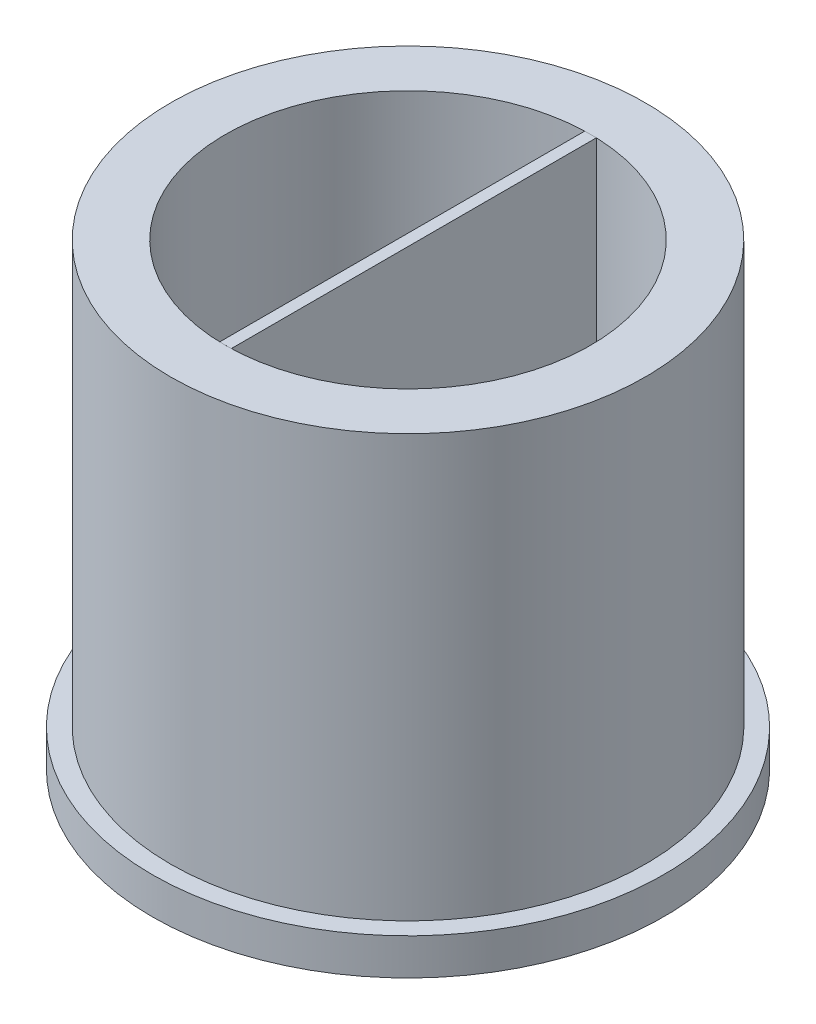
ISO-10303-21;
HEADER;
FILE_DESCRIPTION(('STEP AP214'),'2;1');
FILE_NAME('part.step','',(''),(''),'','','');
FILE_SCHEMA(('AUTOMOTIVE_DESIGN { 1 0 10303 214 1 1 1 1 }'));
ENDSEC;
DATA;
#1=APPLICATION_CONTEXT('core data for automotive mechanical design processes');
#2=APPLICATION_PROTOCOL_DEFINITION('international standard','automotive_design',2000,#1);
#3=PRODUCT_CONTEXT('',#1,'mechanical');
#4=PRODUCT('Part','Part','',(#3));
#5=PRODUCT_RELATED_PRODUCT_CATEGORY('part','',(#4));
#6=PRODUCT_DEFINITION_FORMATION('','',#4);
#7=PRODUCT_DEFINITION_CONTEXT('part definition',#1,'design');
#8=PRODUCT_DEFINITION('design','',#6,#7);
#9=PRODUCT_DEFINITION_SHAPE('','',#8);
#10=(LENGTH_UNIT() NAMED_UNIT(*) SI_UNIT(.MILLI.,.METRE.));
#11=(NAMED_UNIT(*) PLANE_ANGLE_UNIT() SI_UNIT($,.RADIAN.));
#12=(NAMED_UNIT(*) SI_UNIT($,.STERADIAN.) SOLID_ANGLE_UNIT());
#13=UNCERTAINTY_MEASURE_WITH_UNIT(LENGTH_MEASURE(1.E-05),#10,'distance_accuracy_value','');
#14=(GEOMETRIC_REPRESENTATION_CONTEXT(3) GLOBAL_UNCERTAINTY_ASSIGNED_CONTEXT((#13)) GLOBAL_UNIT_ASSIGNED_CONTEXT((#10,
#11,#12)) REPRESENTATION_CONTEXT('',''));
#15=CARTESIAN_POINT('',(0.,0.,0.));
#16=DIRECTION('',(0.,0.,1.));
#17=DIRECTION('',(1.,0.,0.));
#18=AXIS2_PLACEMENT_3D('',#15,#16,#17);
#19=CARTESIAN_POINT('',(0.,-10.,0.));
#20=DIRECTION('',(0.,1.,0.));
#21=DIRECTION('',(0.,0.,1.));
#22=AXIS2_PLACEMENT_3D('',#19,#20,#21);
#23=CYLINDRICAL_SURFACE('',#22,140.);
#24=CARTESIAN_POINT('',(0.,-10.,0.));
#25=DIRECTION('',(0.,1.,0.));
#26=DIRECTION('',(0.,0.,1.));
#27=AXIS2_PLACEMENT_3D('',#24,#25,#26);
#28=CIRCLE('',#27,140.);
#29=CARTESIAN_POINT('',(0.,-10.,140.));
#30=VERTEX_POINT('',#29);
#31=EDGE_CURVE('E11',#30,#30,#28,.T.);
#32=ORIENTED_EDGE('',*,*,#31,.T.);
#33=EDGE_LOOP('',(#32));
#34=FACE_BOUND('',#33,.T.);
#35=CARTESIAN_POINT('',(0.,10.,0.));
#36=DIRECTION('',(0.,1.,0.));
#37=DIRECTION('',(0.,0.,1.));
#38=AXIS2_PLACEMENT_3D('',#35,#36,#37);
#39=CIRCLE('',#38,140.);
#40=CARTESIAN_POINT('',(0.,10.,140.));
#41=VERTEX_POINT('',#40);
#42=EDGE_CURVE('E62',#41,#41,#39,.T.);
#43=ORIENTED_EDGE('',*,*,#42,.F.);
#44=EDGE_LOOP('',(#43));
#45=FACE_BOUND('',#44,.T.);
#46=ADVANCED_FACE('F56',(#34,#45),#23,.T.);
#47=CARTESIAN_POINT('',(0.,-10.,0.));
#48=DIRECTION('',(0.,1.,0.));
#49=DIRECTION('',(0.,0.,1.));
#50=AXIS2_PLACEMENT_3D('',#47,#48,#49);
#51=PLANE('',#50);
#52=ORIENTED_EDGE('',*,*,#31,.F.);
#53=EDGE_LOOP('',(#52));
#54=FACE_BOUND('',#53,.T.);
#55=ADVANCED_FACE('F86',(#54),#51,.F.);
#56=CARTESIAN_POINT('',(0.,10.,0.));
#57=DIRECTION('',(0.,1.,0.));
#58=DIRECTION('',(0.,0.,1.));
#59=AXIS2_PLACEMENT_3D('',#56,#57,#58);
#60=PLANE('',#59);
#61=ORIENTED_EDGE('',*,*,#42,.T.);
#62=EDGE_LOOP('',(#61));
#63=FACE_BOUND('',#62,.T.);
#64=CARTESIAN_POINT('',(0.,10.,0.));
#65=DIRECTION('',(0.,1.,0.));
#66=DIRECTION('',(0.,0.,1.));
#67=AXIS2_PLACEMENT_3D('',#64,#65,#66);
#68=CIRCLE('',#67,130.);
#69=CARTESIAN_POINT('',(0.,10.,130.));
#70=VERTEX_POINT('',#69);
#71=EDGE_CURVE('E66',#70,#70,#68,.T.);
#72=ORIENTED_EDGE('',*,*,#71,.F.);
#73=EDGE_LOOP('',(#72));
#74=FACE_BOUND('',#73,.T.);
#75=ADVANCED_FACE('F80',(#63,#74),#60,.T.);
#76=CARTESIAN_POINT('',(0.,10.,0.));
#77=DIRECTION('',(0.,-1.,0.));
#78=DIRECTION('',(0.,0.,-1.));
#79=AXIS2_PLACEMENT_3D('',#76,#77,#78);
#80=CYLINDRICAL_SURFACE('',#79,130.);
#81=ORIENTED_EDGE('',*,*,#71,.T.);
#82=EDGE_LOOP('',(#81));
#83=FACE_BOUND('',#82,.T.);
#84=CARTESIAN_POINT('',(0.,0.,0.));
#85=DIRECTION('',(0.,1.,0.));
#86=DIRECTION('',(0.,0.,1.));
#87=AXIS2_PLACEMENT_3D('',#84,#85,#86);
#88=CIRCLE('',#87,130.);
#89=CARTESIAN_POINT('',(0.,0.,130.));
#90=VERTEX_POINT('',#89);
#91=EDGE_CURVE('E70',#90,#90,#88,.T.);
#92=ORIENTED_EDGE('',*,*,#91,.F.);
#93=EDGE_LOOP('',(#92));
#94=FACE_BOUND('',#93,.T.);
#95=ADVANCED_FACE('F78',(#83,#94),#80,.F.);
#96=CARTESIAN_POINT('',(0.,0.,0.));
#97=DIRECTION('',(0.,1.,0.));
#98=DIRECTION('',(0.,0.,1.));
#99=AXIS2_PLACEMENT_3D('',#96,#97,#98);
#100=PLANE('',#99);
#101=ORIENTED_EDGE('',*,*,#91,.T.);
#102=EDGE_LOOP('',(#101));
#103=FACE_BOUND('',#102,.T.);
#104=ADVANCED_FACE('F76',(#103),#100,.T.);
#105=CLOSED_SHELL('',(#46,#55,#75,#95,#104));
#106=MANIFOLD_SOLID_BREP('B2',#105);
#107=CARTESIAN_POINT('',(-3.175,241.01,-99.9495841662185));
#108=DIRECTION('',(0.,0.,1.));
#109=DIRECTION('',(1.,0.,0.));
#110=AXIS2_PLACEMENT_3D('',#107,#108,#109);
#111=PLANE('',#110);
#112=DIRECTION('',(-1.,0.,0.));
#113=VECTOR('',#112,1.);
#114=CARTESIAN_POINT('',(-3.175,0.,-99.9495841662185));
#115=LINE('',#114,#113);
#116=CARTESIAN_POINT('',(3.175,0.,-99.9495841662185));
#117=VERTEX_POINT('',#116);
#118=CARTESIAN_POINT('',(-3.175,0.,-99.9495841662185));
#119=VERTEX_POINT('',#118);
#120=EDGE_CURVE('E204',#117,#119,#115,.T.);
#121=ORIENTED_EDGE('',*,*,#120,.T.);
#122=DIRECTION('',(0.,-1.,0.));
#123=VECTOR('',#122,1.);
#124=CARTESIAN_POINT('',(-3.175,241.01,-99.9495841662185));
#125=LINE('',#124,#123);
#126=CARTESIAN_POINT('',(-3.175,241.01,-99.9495841662185));
#127=VERTEX_POINT('',#126);
#128=EDGE_CURVE('E54',#127,#119,#125,.T.);
#129=ORIENTED_EDGE('',*,*,#128,.F.);
#130=DIRECTION('',(-1.,0.,0.));
#131=VECTOR('',#130,1.);
#132=CARTESIAN_POINT('',(-3.175,241.01,-99.9495841662185));
#133=LINE('',#132,#131);
#134=CARTESIAN_POINT('',(3.175,241.01,-99.9495841662185));
#135=VERTEX_POINT('',#134);
#136=EDGE_CURVE('E192',#135,#127,#133,.T.);
#137=ORIENTED_EDGE('',*,*,#136,.F.);
#138=DIRECTION('',(0.,-1.,0.));
#139=VECTOR('',#138,1.);
#140=CARTESIAN_POINT('',(3.175,241.01,-99.9495841662185));
#141=LINE('',#140,#139);
#142=EDGE_CURVE('E200',#135,#117,#141,.T.);
#143=ORIENTED_EDGE('',*,*,#142,.T.);
#144=EDGE_LOOP('',(#121,#129,#137,#143));
#145=FACE_BOUND('',#144,.T.);
#146=ADVANCED_FACE('F141',(#145),#111,.F.);
#147=CARTESIAN_POINT('',(-3.175,241.01,-99.9495841662185));
#148=DIRECTION('',(1.,0.,0.));
#149=DIRECTION('',(0.,0.,-1.));
#150=AXIS2_PLACEMENT_3D('',#147,#148,#149);
#151=PLANE('',#150);
#152=DIRECTION('',(0.,0.,1.));
#153=VECTOR('',#152,1.);
#154=CARTESIAN_POINT('',(-3.175,0.,-99.9495841662185));
#155=LINE('',#154,#153);
#156=CARTESIAN_POINT('',(-3.175,0.,99.9495841662185));
#157=VERTEX_POINT('',#156);
#158=EDGE_CURVE('E196',#119,#157,#155,.T.);
#159=ORIENTED_EDGE('',*,*,#158,.T.);
#160=DIRECTION('',(0.,-1.,0.));
#161=VECTOR('',#160,1.);
#162=CARTESIAN_POINT('',(-3.175,241.01,99.9495841662185));
#163=LINE('',#162,#161);
#164=CARTESIAN_POINT('',(-3.175,241.01,99.9495841662185));
#165=VERTEX_POINT('',#164);
#166=EDGE_CURVE('E149',#165,#157,#163,.T.);
#167=ORIENTED_EDGE('',*,*,#166,.F.);
#168=DIRECTION('',(0.,0.,1.));
#169=VECTOR('',#168,1.);
#170=CARTESIAN_POINT('',(-3.175,241.01,-99.9495841662185));
#171=LINE('',#170,#169);
#172=EDGE_CURVE('E187',#127,#165,#171,.T.);
#173=ORIENTED_EDGE('',*,*,#172,.F.);
#174=ORIENTED_EDGE('',*,*,#128,.T.);
#175=EDGE_LOOP('',(#159,#167,#173,#174));
#176=FACE_BOUND('',#175,.T.);
#177=ADVANCED_FACE('F195',(#176),#151,.F.);
#178=CARTESIAN_POINT('',(-3.175,241.01,99.9495841662185));
#179=DIRECTION('',(0.,0.,-1.));
#180=DIRECTION('',(-1.,0.,0.));
#181=AXIS2_PLACEMENT_3D('',#178,#179,#180);
#182=PLANE('',#181);
#183=DIRECTION('',(1.,0.,0.));
#184=VECTOR('',#183,1.);
#185=CARTESIAN_POINT('',(-3.175,0.,99.9495841662185));
#186=LINE('',#185,#184);
#187=CARTESIAN_POINT('',(3.175,0.,99.9495841662185));
#188=VERTEX_POINT('',#187);
#189=EDGE_CURVE('E174',#157,#188,#186,.T.);
#190=ORIENTED_EDGE('',*,*,#189,.T.);
#191=DIRECTION('',(0.,-1.,0.));
#192=VECTOR('',#191,1.);
#193=CARTESIAN_POINT('',(3.175,241.01,99.9495841662185));
#194=LINE('',#193,#192);
#195=CARTESIAN_POINT('',(3.175,241.01,99.9495841662185));
#196=VERTEX_POINT('',#195);
#197=EDGE_CURVE('E197',#196,#188,#194,.T.);
#198=ORIENTED_EDGE('',*,*,#197,.F.);
#199=DIRECTION('',(1.,0.,0.));
#200=VECTOR('',#199,1.);
#201=CARTESIAN_POINT('',(-3.175,241.01,99.9495841662185));
#202=LINE('',#201,#200);
#203=EDGE_CURVE('E190',#165,#196,#202,.T.);
#204=ORIENTED_EDGE('',*,*,#203,.F.);
#205=ORIENTED_EDGE('',*,*,#166,.T.);
#206=EDGE_LOOP('',(#190,#198,#204,#205));
#207=FACE_BOUND('',#206,.T.);
#208=ADVANCED_FACE('F198',(#207),#182,.F.);
#209=CARTESIAN_POINT('',(3.175,241.01,99.9495841662185));
#210=DIRECTION('',(-1.,0.,0.));
#211=DIRECTION('',(0.,0.,1.));
#212=AXIS2_PLACEMENT_3D('',#209,#210,#211);
#213=PLANE('',#212);
#214=DIRECTION('',(0.,0.,-1.));
#215=VECTOR('',#214,1.);
#216=CARTESIAN_POINT('',(3.175,0.,99.9495841662185));
#217=LINE('',#216,#215);
#218=EDGE_CURVE('E180',#188,#117,#217,.T.);
#219=ORIENTED_EDGE('',*,*,#218,.T.);
#220=ORIENTED_EDGE('',*,*,#142,.F.);
#221=DIRECTION('',(0.,0.,-1.));
#222=VECTOR('',#221,1.);
#223=CARTESIAN_POINT('',(3.175,241.01,99.9495841662185));
#224=LINE('',#223,#222);
#225=EDGE_CURVE('E157',#196,#135,#224,.T.);
#226=ORIENTED_EDGE('',*,*,#225,.F.);
#227=ORIENTED_EDGE('',*,*,#197,.T.);
#228=EDGE_LOOP('',(#219,#220,#226,#227));
#229=FACE_BOUND('',#228,.T.);
#230=ADVANCED_FACE('F211',(#229),#213,.F.);
#231=CARTESIAN_POINT('',(0.,241.01,0.));
#232=DIRECTION('',(0.,1.,0.));
#233=DIRECTION('',(0.,0.,1.));
#234=AXIS2_PLACEMENT_3D('',#231,#232,#233);
#235=PLANE('',#234);
#236=ORIENTED_EDGE('',*,*,#136,.T.);
#237=ORIENTED_EDGE('',*,*,#172,.T.);
#238=ORIENTED_EDGE('',*,*,#203,.T.);
#239=ORIENTED_EDGE('',*,*,#225,.T.);
#240=EDGE_LOOP('',(#236,#237,#238,#239));
#241=FACE_BOUND('',#240,.T.);
#242=ADVANCED_FACE('F188',(#241),#235,.T.);
#243=CARTESIAN_POINT('',(0.,0.,0.));
#244=DIRECTION('',(0.,1.,0.));
#245=DIRECTION('',(0.,0.,1.));
#246=AXIS2_PLACEMENT_3D('',#243,#244,#245);
#247=PLANE('',#246);
#248=ORIENTED_EDGE('',*,*,#120,.F.);
#249=ORIENTED_EDGE('',*,*,#218,.F.);
#250=ORIENTED_EDGE('',*,*,#189,.F.);
#251=ORIENTED_EDGE('',*,*,#158,.F.);
#252=EDGE_LOOP('',(#248,#249,#250,#251));
#253=FACE_BOUND('',#252,.T.);
#254=ADVANCED_FACE('F214',(#253),#247,.F.);
#255=CLOSED_SHELL('',(#146,#177,#208,#230,#242,#254));
#256=MANIFOLD_SOLID_BREP('B6',#255);
#257=CARTESIAN_POINT('',(0.,241.01,0.));
#258=DIRECTION('',(0.,-1.,0.));
#259=DIRECTION('',(0.,0.,-1.));
#260=AXIS2_PLACEMENT_3D('',#257,#258,#259);
#261=CYLINDRICAL_SURFACE('',#260,130.);
#262=CARTESIAN_POINT('',(0.,241.01,0.));
#263=DIRECTION('',(0.,1.,0.));
#264=DIRECTION('',(0.,0.,1.));
#265=AXIS2_PLACEMENT_3D('',#262,#263,#264);
#266=CIRCLE('',#265,130.);
#267=CARTESIAN_POINT('',(0.,241.01,130.));
#268=VERTEX_POINT('',#267);
#269=EDGE_CURVE('E140',#268,#268,#266,.T.);
#270=ORIENTED_EDGE('',*,*,#269,.F.);
#271=EDGE_LOOP('',(#270));
#272=FACE_BOUND('',#271,.T.);
#273=CARTESIAN_POINT('',(0.,0.,0.));
#274=DIRECTION('',(0.,1.,0.));
#275=DIRECTION('',(0.,0.,1.));
#276=AXIS2_PLACEMENT_3D('',#273,#274,#275);
#277=CIRCLE('',#276,130.);
#278=CARTESIAN_POINT('',(0.,0.,130.));
#279=VERTEX_POINT('',#278);
#280=EDGE_CURVE('E268',#279,#279,#277,.T.);
#281=ORIENTED_EDGE('',*,*,#280,.T.);
#282=EDGE_LOOP('',(#281));
#283=FACE_BOUND('',#282,.T.);
#284=ADVANCED_FACE('F265',(#272,#283),#261,.T.);
#285=CARTESIAN_POINT('',(0.,241.01,0.));
#286=DIRECTION('',(0.,1.,0.));
#287=DIRECTION('',(0.,0.,1.));
#288=AXIS2_PLACEMENT_3D('',#285,#286,#287);
#289=PLANE('',#288);
#290=CARTESIAN_POINT('',(0.,241.01,0.));
#291=DIRECTION('',(0.,1.,0.));
#292=DIRECTION('',(0.,0.,1.));
#293=AXIS2_PLACEMENT_3D('',#290,#291,#292);
#294=CIRCLE('',#293,100.);
#295=CARTESIAN_POINT('',(0.,241.01,100.));
#296=VERTEX_POINT('',#295);
#297=EDGE_CURVE('E279',#296,#296,#294,.T.);
#298=ORIENTED_EDGE('',*,*,#297,.F.);
#299=EDGE_LOOP('',(#298));
#300=FACE_BOUND('',#299,.T.);
#301=ORIENTED_EDGE('',*,*,#269,.T.);
#302=EDGE_LOOP('',(#301));
#303=FACE_BOUND('',#302,.T.);
#304=ADVANCED_FACE('F296',(#300,#303),#289,.T.);
#305=CARTESIAN_POINT('',(0.,0.,0.));
#306=DIRECTION('',(0.,1.,0.));
#307=DIRECTION('',(0.,0.,1.));
#308=AXIS2_PLACEMENT_3D('',#305,#306,#307);
#309=PLANE('',#308);
#310=CARTESIAN_POINT('',(0.,0.,0.));
#311=DIRECTION('',(0.,1.,0.));
#312=DIRECTION('',(0.,0.,1.));
#313=AXIS2_PLACEMENT_3D('',#310,#311,#312);
#314=CIRCLE('',#313,100.);
#315=CARTESIAN_POINT('',(0.,0.,100.));
#316=VERTEX_POINT('',#315);
#317=EDGE_CURVE('E277',#316,#316,#314,.T.);
#318=ORIENTED_EDGE('',*,*,#317,.T.);
#319=EDGE_LOOP('',(#318));
#320=FACE_BOUND('',#319,.T.);
#321=ORIENTED_EDGE('',*,*,#280,.F.);
#322=EDGE_LOOP('',(#321));
#323=FACE_BOUND('',#322,.T.);
#324=ADVANCED_FACE('F287',(#320,#323),#309,.F.);
#325=CARTESIAN_POINT('',(0.,0.,0.));
#326=DIRECTION('',(0.,1.,0.));
#327=DIRECTION('',(0.,0.,1.));
#328=AXIS2_PLACEMENT_3D('',#325,#326,#327);
#329=CYLINDRICAL_SURFACE('',#328,100.);
#330=ORIENTED_EDGE('',*,*,#317,.F.);
#331=EDGE_LOOP('',(#330));
#332=FACE_BOUND('',#331,.T.);
#333=ORIENTED_EDGE('',*,*,#297,.T.);
#334=EDGE_LOOP('',(#333));
#335=FACE_BOUND('',#334,.T.);
#336=ADVANCED_FACE('F290',(#332,#335),#329,.F.);
#337=CLOSED_SHELL('',(#284,#304,#324,#336));
#338=MANIFOLD_SOLID_BREP('B48',#337);
#339=ADVANCED_BREP_SHAPE_REPRESENTATION('',(#18,#106,#256,#338),#14);
#340=SHAPE_DEFINITION_REPRESENTATION(#9,#339);
ENDSEC;
END-ISO-10303-21;
